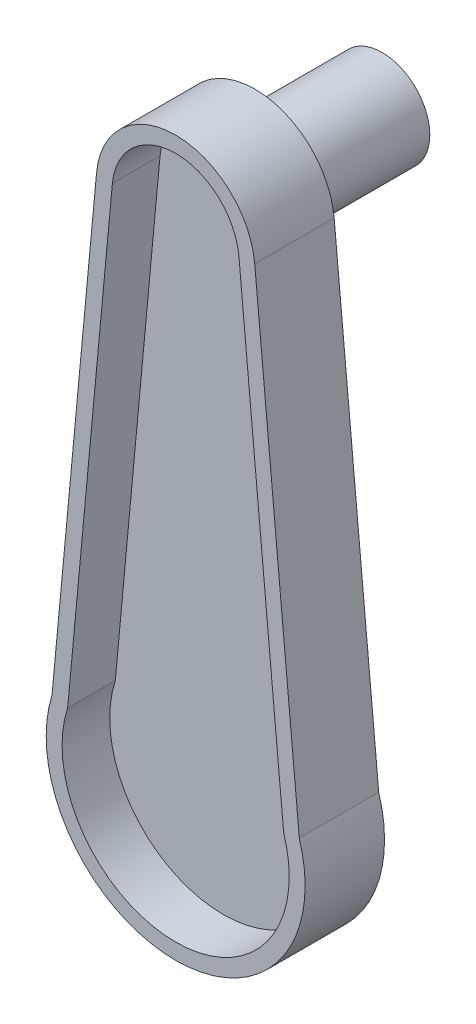
ISO-10303-21;
HEADER;
FILE_DESCRIPTION(('STEP AP214'),'2;1');
FILE_NAME('part.step','',(''),(''),'','','');
FILE_SCHEMA(('AUTOMOTIVE_DESIGN { 1 0 10303 214 1 1 1 1 }'));
ENDSEC;
DATA;
#1=APPLICATION_CONTEXT('core data for automotive mechanical design processes');
#2=APPLICATION_PROTOCOL_DEFINITION('international standard','automotive_design',2000,#1);
#3=PRODUCT_CONTEXT('',#1,'mechanical');
#4=PRODUCT('Part','Part','',(#3));
#5=PRODUCT_RELATED_PRODUCT_CATEGORY('part','',(#4));
#6=PRODUCT_DEFINITION_FORMATION('','',#4);
#7=PRODUCT_DEFINITION_CONTEXT('part definition',#1,'design');
#8=PRODUCT_DEFINITION('design','',#6,#7);
#9=PRODUCT_DEFINITION_SHAPE('','',#8);
#10=(LENGTH_UNIT() NAMED_UNIT(*) SI_UNIT(.MILLI.,.METRE.));
#11=(NAMED_UNIT(*) PLANE_ANGLE_UNIT() SI_UNIT($,.RADIAN.));
#12=(NAMED_UNIT(*) SI_UNIT($,.STERADIAN.) SOLID_ANGLE_UNIT());
#13=UNCERTAINTY_MEASURE_WITH_UNIT(LENGTH_MEASURE(1.E-05),#10,'distance_accuracy_value','');
#14=(GEOMETRIC_REPRESENTATION_CONTEXT(3) GLOBAL_UNCERTAINTY_ASSIGNED_CONTEXT((#13)) GLOBAL_UNIT_ASSIGNED_CONTEXT((#10,
#11,#12)) REPRESENTATION_CONTEXT('',''));
#15=CARTESIAN_POINT('',(0.,0.,0.));
#16=DIRECTION('',(0.,0.,1.));
#17=DIRECTION('',(1.,0.,0.));
#18=AXIS2_PLACEMENT_3D('',#15,#16,#17);
#19=CARTESIAN_POINT('',(0.,0.,1.));
#20=DIRECTION('',(0.,0.,1.));
#21=DIRECTION('',(1.,0.,0.));
#22=AXIS2_PLACEMENT_3D('',#19,#20,#21);
#23=PLANE('',#22);
#24=CARTESIAN_POINT('',(0.,0.,1.));
#25=DIRECTION('',(0.,0.,1.));
#26=DIRECTION('',(1.,0.,0.));
#27=AXIS2_PLACEMENT_3D('',#24,#25,#26);
#28=CIRCLE('',#27,3.575);
#29=CARTESIAN_POINT('',(-3.4,1.10481898969922,1.));
#30=VERTEX_POINT('',#29);
#31=CARTESIAN_POINT('',(3.4,1.10481898969922,1.));
#32=VERTEX_POINT('',#31);
#33=EDGE_CURVE('E211',#30,#32,#28,.T.);
#34=ORIENTED_EDGE('',*,*,#33,.T.);
#35=DIRECTION('',(-0.0934615986664953,0.995622885220455,0.));
#36=VECTOR('',#35,1.);
#37=CARTESIAN_POINT('',(3.4,1.10481898969922,1.));
#38=LINE('',#37,#36);
#39=CARTESIAN_POINT('',(1.99124577044091,16.111923197333,1.));
#40=VERTEX_POINT('',#39);
#41=EDGE_CURVE('E83',#32,#40,#38,.T.);
#42=ORIENTED_EDGE('',*,*,#41,.T.);
#43=CARTESIAN_POINT('',(0.,15.925,1.));
#44=DIRECTION('',(0.,0.,-1.));
#45=DIRECTION('',(-1.,0.,0.));
#46=AXIS2_PLACEMENT_3D('',#43,#44,#45);
#47=CIRCLE('',#46,2.);
#48=CARTESIAN_POINT('',(-1.99124577044091,16.111923197333,1.));
#49=VERTEX_POINT('',#48);
#50=EDGE_CURVE('E216',#49,#40,#47,.T.);
#51=ORIENTED_EDGE('',*,*,#50,.F.);
#52=DIRECTION('',(0.0934615986664953,0.995622885220455,0.));
#53=VECTOR('',#52,1.);
#54=CARTESIAN_POINT('',(-3.4,1.10481898969922,1.));
#55=LINE('',#54,#53);
#56=EDGE_CURVE('E72',#30,#49,#55,.T.);
#57=ORIENTED_EDGE('',*,*,#56,.F.);
#58=EDGE_LOOP('',(#34,#42,#51,#57));
#59=FACE_BOUND('',#58,.T.);
#60=ADVANCED_FACE('F63',(#59),#23,.T.);
#61=CARTESIAN_POINT('',(0.,0.,2.5));
#62=DIRECTION('',(0.,0.,1.));
#63=DIRECTION('',(1.,0.,0.));
#64=AXIS2_PLACEMENT_3D('',#61,#62,#63);
#65=PLANE('',#64);
#66=CARTESIAN_POINT('',(0.,0.,2.5));
#67=DIRECTION('',(0.,0.,1.));
#68=DIRECTION('',(1.,0.,0.));
#69=AXIS2_PLACEMENT_3D('',#66,#67,#68);
#70=CIRCLE('',#69,4.075);
#71=CARTESIAN_POINT('',(-3.89280761632953,1.20485429087933,2.5));
#72=VERTEX_POINT('',#71);
#73=CARTESIAN_POINT('',(3.89280761632953,1.20485429087933,2.5));
#74=VERTEX_POINT('',#73);
#75=EDGE_CURVE('E170',#72,#74,#70,.T.);
#76=ORIENTED_EDGE('',*,*,#75,.T.);
#77=DIRECTION('',(-0.0934615986664953,0.995622885220455,0.));
#78=VECTOR('',#77,1.);
#79=CARTESIAN_POINT('',(3.89781144261023,1.15154978903247,2.5));
#80=LINE('',#79,#78);
#81=CARTESIAN_POINT('',(2.48905721305114,16.1586539966662,2.5));
#82=VERTEX_POINT('',#81);
#83=EDGE_CURVE('E174',#74,#82,#80,.T.);
#84=ORIENTED_EDGE('',*,*,#83,.T.);
#85=CARTESIAN_POINT('',(0.,15.925,2.5));
#86=DIRECTION('',(0.,0.,1.));
#87=DIRECTION('',(1.,0.,0.));
#88=AXIS2_PLACEMENT_3D('',#85,#86,#87);
#89=CIRCLE('',#88,2.5);
#90=CARTESIAN_POINT('',(-2.48905721305114,16.1586539966662,2.5));
#91=VERTEX_POINT('',#90);
#92=EDGE_CURVE('E178',#82,#91,#89,.T.);
#93=ORIENTED_EDGE('',*,*,#92,.T.);
#94=DIRECTION('',(-0.0934615986664953,-0.995622885220455,0.));
#95=VECTOR('',#94,1.);
#96=CARTESIAN_POINT('',(-3.89781144261023,1.15154978903247,2.5));
#97=LINE('',#96,#95);
#98=EDGE_CURVE('E181',#91,#72,#97,.T.);
#99=ORIENTED_EDGE('',*,*,#98,.T.);
#100=EDGE_LOOP('',(#76,#84,#93,#99));
#101=FACE_BOUND('',#100,.T.);
#102=DIRECTION('',(-0.0934615986664953,0.995622885220455,0.));
#103=VECTOR('',#102,1.);
#104=CARTESIAN_POINT('',(3.4,1.10481898969922,2.5));
#105=LINE('',#104,#103);
#106=CARTESIAN_POINT('',(3.4,1.10481898969922,2.5));
#107=VERTEX_POINT('',#106);
#108=CARTESIAN_POINT('',(1.99124577044091,16.111923197333,2.5));
#109=VERTEX_POINT('',#108);
#110=EDGE_CURVE('E138',#107,#109,#105,.T.);
#111=ORIENTED_EDGE('',*,*,#110,.F.);
#112=CARTESIAN_POINT('',(0.,0.,2.5));
#113=DIRECTION('',(0.,0.,1.));
#114=DIRECTION('',(1.,0.,0.));
#115=AXIS2_PLACEMENT_3D('',#112,#113,#114);
#116=CIRCLE('',#115,3.575);
#117=CARTESIAN_POINT('',(-3.4,1.10481898969922,2.5));
#118=VERTEX_POINT('',#117);
#119=EDGE_CURVE('E128',#118,#107,#116,.T.);
#120=ORIENTED_EDGE('',*,*,#119,.F.);
#121=DIRECTION('',(-0.0934615986664953,-0.995622885220455,0.));
#122=VECTOR('',#121,1.);
#123=CARTESIAN_POINT('',(-3.4,1.10481898969922,2.5));
#124=LINE('',#123,#122);
#125=CARTESIAN_POINT('',(-1.99124577044091,16.111923197333,2.5));
#126=VERTEX_POINT('',#125);
#127=EDGE_CURVE('E156',#126,#118,#124,.T.);
#128=ORIENTED_EDGE('',*,*,#127,.F.);
#129=CARTESIAN_POINT('',(0.,15.925,2.5));
#130=DIRECTION('',(0.,0.,1.));
#131=DIRECTION('',(-1.,0.,0.));
#132=AXIS2_PLACEMENT_3D('',#129,#130,#131);
#133=CIRCLE('',#132,2.);
#134=EDGE_CURVE('E152',#109,#126,#133,.T.);
#135=ORIENTED_EDGE('',*,*,#134,.F.);
#136=EDGE_LOOP('',(#111,#120,#128,#135));
#137=FACE_BOUND('',#136,.T.);
#138=ADVANCED_FACE('F150',(#101,#137),#65,.T.);
#139=CARTESIAN_POINT('',(0.,0.,2.5));
#140=DIRECTION('',(0.,0.,-1.));
#141=DIRECTION('',(-1.,0.,0.));
#142=AXIS2_PLACEMENT_3D('',#139,#140,#141);
#143=CYLINDRICAL_SURFACE('',#142,4.075);
#144=CARTESIAN_POINT('',(0.,0.,0.));
#145=DIRECTION('',(0.,0.,1.));
#146=DIRECTION('',(1.,0.,0.));
#147=AXIS2_PLACEMENT_3D('',#144,#145,#146);
#148=CIRCLE('',#147,4.075);
#149=CARTESIAN_POINT('',(-3.89280761632953,1.20485429087933,0.));
#150=VERTEX_POINT('',#149);
#151=CARTESIAN_POINT('',(3.89280761632953,1.20485429087933,0.));
#152=VERTEX_POINT('',#151);
#153=EDGE_CURVE('E146',#150,#152,#148,.T.);
#154=ORIENTED_EDGE('',*,*,#153,.T.);
#155=DIRECTION('',(0.,0.,-1.));
#156=VECTOR('',#155,1.);
#157=CARTESIAN_POINT('',(3.89280761632953,1.20485429087933,2.5));
#158=LINE('',#157,#156);
#159=EDGE_CURVE('E207',#74,#152,#158,.T.);
#160=ORIENTED_EDGE('',*,*,#159,.F.);
#161=ORIENTED_EDGE('',*,*,#75,.F.);
#162=DIRECTION('',(0.,0.,-1.));
#163=VECTOR('',#162,1.);
#164=CARTESIAN_POINT('',(-3.89280761632953,1.20485429087933,2.5));
#165=LINE('',#164,#163);
#166=EDGE_CURVE('E184',#72,#150,#165,.T.);
#167=ORIENTED_EDGE('',*,*,#166,.T.);
#168=EDGE_LOOP('',(#154,#160,#161,#167));
#169=FACE_BOUND('',#168,.T.);
#170=ADVANCED_FACE('F227',(#169),#143,.T.);
#171=CARTESIAN_POINT('',(3.89781144261023,1.15154978903247,2.5));
#172=DIRECTION('',(-0.995622885220455,-0.0934615986664953,0.));
#173=DIRECTION('',(0.0934615986664953,-0.995622885220455,0.));
#174=AXIS2_PLACEMENT_3D('',#171,#172,#173);
#175=PLANE('',#174);
#176=DIRECTION('',(-0.0934615986664953,0.995622885220455,0.));
#177=VECTOR('',#176,1.);
#178=CARTESIAN_POINT('',(3.89781144261023,1.15154978903247,0.));
#179=LINE('',#178,#177);
#180=CARTESIAN_POINT('',(2.48905721305114,16.1586539966662,0.));
#181=VERTEX_POINT('',#180);
#182=EDGE_CURVE('E188',#152,#181,#179,.T.);
#183=ORIENTED_EDGE('',*,*,#182,.T.);
#184=DIRECTION('',(0.,0.,-1.));
#185=VECTOR('',#184,1.);
#186=CARTESIAN_POINT('',(2.48905721305114,16.1586539966662,2.5));
#187=LINE('',#186,#185);
#188=EDGE_CURVE('E203',#82,#181,#187,.T.);
#189=ORIENTED_EDGE('',*,*,#188,.F.);
#190=ORIENTED_EDGE('',*,*,#83,.F.);
#191=ORIENTED_EDGE('',*,*,#159,.T.);
#192=EDGE_LOOP('',(#183,#189,#190,#191));
#193=FACE_BOUND('',#192,.T.);
#194=ADVANCED_FACE('F233',(#193),#175,.F.);
#195=CARTESIAN_POINT('',(0.,15.925,2.5));
#196=DIRECTION('',(0.,0.,-1.));
#197=DIRECTION('',(-1.,0.,0.));
#198=AXIS2_PLACEMENT_3D('',#195,#196,#197);
#199=CYLINDRICAL_SURFACE('',#198,2.5);
#200=CARTESIAN_POINT('',(0.,15.925,0.));
#201=DIRECTION('',(0.,0.,1.));
#202=DIRECTION('',(1.,0.,0.));
#203=AXIS2_PLACEMENT_3D('',#200,#201,#202);
#204=CIRCLE('',#203,2.5);
#205=CARTESIAN_POINT('',(-2.48905721305114,16.1586539966662,0.));
#206=VERTEX_POINT('',#205);
#207=EDGE_CURVE('E191',#181,#206,#204,.T.);
#208=ORIENTED_EDGE('',*,*,#207,.T.);
#209=DIRECTION('',(0.,0.,-1.));
#210=VECTOR('',#209,1.);
#211=CARTESIAN_POINT('',(-2.48905721305114,16.1586539966662,2.5));
#212=LINE('',#211,#210);
#213=EDGE_CURVE('E199',#91,#206,#212,.T.);
#214=ORIENTED_EDGE('',*,*,#213,.F.);
#215=ORIENTED_EDGE('',*,*,#92,.F.);
#216=ORIENTED_EDGE('',*,*,#188,.T.);
#217=EDGE_LOOP('',(#208,#214,#215,#216));
#218=FACE_BOUND('',#217,.T.);
#219=ADVANCED_FACE('F237',(#218),#199,.T.);
#220=CARTESIAN_POINT('',(-3.89781144261023,1.15154978903247,2.5));
#221=DIRECTION('',(0.995622885220455,-0.0934615986664953,0.));
#222=DIRECTION('',(0.0934615986664953,0.995622885220455,0.));
#223=AXIS2_PLACEMENT_3D('',#220,#221,#222);
#224=PLANE('',#223);
#225=DIRECTION('',(-0.0934615986664953,-0.995622885220455,0.));
#226=VECTOR('',#225,1.);
#227=CARTESIAN_POINT('',(-3.89781144261023,1.15154978903247,0.));
#228=LINE('',#227,#226);
#229=EDGE_CURVE('E175',#206,#150,#228,.T.);
#230=ORIENTED_EDGE('',*,*,#229,.T.);
#231=ORIENTED_EDGE('',*,*,#166,.F.);
#232=ORIENTED_EDGE('',*,*,#98,.F.);
#233=ORIENTED_EDGE('',*,*,#213,.T.);
#234=EDGE_LOOP('',(#230,#231,#232,#233));
#235=FACE_BOUND('',#234,.T.);
#236=ADVANCED_FACE('F241',(#235),#224,.F.);
#237=CARTESIAN_POINT('',(0.,0.,2.5));
#238=DIRECTION('',(0.,0.,-1.));
#239=DIRECTION('',(-1.,0.,0.));
#240=AXIS2_PLACEMENT_3D('',#237,#238,#239);
#241=CYLINDRICAL_SURFACE('',#240,3.575);
#242=DIRECTION('',(0.,0.,-1.));
#243=VECTOR('',#242,1.);
#244=CARTESIAN_POINT('',(3.4,1.10481898969922,2.5));
#245=LINE('',#244,#243);
#246=EDGE_CURVE('E131',#107,#32,#245,.T.);
#247=ORIENTED_EDGE('',*,*,#246,.T.);
#248=ORIENTED_EDGE('',*,*,#33,.F.);
#249=DIRECTION('',(0.,0.,-1.));
#250=VECTOR('',#249,1.);
#251=CARTESIAN_POINT('',(-3.4,1.10481898969922,2.5));
#252=LINE('',#251,#250);
#253=EDGE_CURVE('E133',#118,#30,#252,.T.);
#254=ORIENTED_EDGE('',*,*,#253,.F.);
#255=ORIENTED_EDGE('',*,*,#119,.T.);
#256=EDGE_LOOP('',(#247,#248,#254,#255));
#257=FACE_BOUND('',#256,.T.);
#258=ADVANCED_FACE('F130',(#257),#241,.F.);
#259=CARTESIAN_POINT('',(3.4,1.10481898969922,2.5));
#260=DIRECTION('',(-0.995622885220455,-0.0934615986664953,0.));
#261=DIRECTION('',(0.0934615986664953,-0.995622885220455,0.));
#262=AXIS2_PLACEMENT_3D('',#259,#260,#261);
#263=PLANE('',#262);
#264=DIRECTION('',(0.,0.,-1.));
#265=VECTOR('',#264,1.);
#266=CARTESIAN_POINT('',(1.99124577044091,16.111923197333,2.5));
#267=LINE('',#266,#265);
#268=EDGE_CURVE('E147',#109,#40,#267,.T.);
#269=ORIENTED_EDGE('',*,*,#268,.T.);
#270=ORIENTED_EDGE('',*,*,#41,.F.);
#271=ORIENTED_EDGE('',*,*,#246,.F.);
#272=ORIENTED_EDGE('',*,*,#110,.T.);
#273=EDGE_LOOP('',(#269,#270,#271,#272));
#274=FACE_BOUND('',#273,.T.);
#275=ADVANCED_FACE('F143',(#274),#263,.T.);
#276=CARTESIAN_POINT('',(0.,15.925,2.5));
#277=DIRECTION('',(0.,0.,-1.));
#278=DIRECTION('',(-1.,0.,0.));
#279=AXIS2_PLACEMENT_3D('',#276,#277,#278);
#280=CYLINDRICAL_SURFACE('',#279,2.);
#281=DIRECTION('',(0.,0.,-1.));
#282=VECTOR('',#281,1.);
#283=CARTESIAN_POINT('',(-1.99124577044091,16.111923197333,2.5));
#284=LINE('',#283,#282);
#285=EDGE_CURVE('E164',#126,#49,#284,.T.);
#286=ORIENTED_EDGE('',*,*,#285,.T.);
#287=ORIENTED_EDGE('',*,*,#50,.T.);
#288=ORIENTED_EDGE('',*,*,#268,.F.);
#289=ORIENTED_EDGE('',*,*,#134,.T.);
#290=EDGE_LOOP('',(#286,#287,#288,#289));
#291=FACE_BOUND('',#290,.T.);
#292=ADVANCED_FACE('F222',(#291),#280,.F.);
#293=CARTESIAN_POINT('',(-3.4,1.10481898969922,2.5));
#294=DIRECTION('',(0.995622885220455,-0.0934615986664953,0.));
#295=DIRECTION('',(0.0934615986664953,0.995622885220455,0.));
#296=AXIS2_PLACEMENT_3D('',#293,#294,#295);
#297=PLANE('',#296);
#298=ORIENTED_EDGE('',*,*,#253,.T.);
#299=ORIENTED_EDGE('',*,*,#56,.T.);
#300=ORIENTED_EDGE('',*,*,#285,.F.);
#301=ORIENTED_EDGE('',*,*,#127,.T.);
#302=EDGE_LOOP('',(#298,#299,#300,#301));
#303=FACE_BOUND('',#302,.T.);
#304=ADVANCED_FACE('F220',(#303),#297,.T.);
#305=CARTESIAN_POINT('',(0.,0.,0.));
#306=DIRECTION('',(0.,0.,1.));
#307=DIRECTION('',(1.,0.,0.));
#308=AXIS2_PLACEMENT_3D('',#305,#306,#307);
#309=PLANE('',#308);
#310=CARTESIAN_POINT('',(0.,15.925,0.));
#311=DIRECTION('',(0.,0.,1.));
#312=DIRECTION('',(1.,0.,0.));
#313=AXIS2_PLACEMENT_3D('',#310,#311,#312);
#314=CIRCLE('',#313,1.5);
#315=CARTESIAN_POINT('',(1.5,15.925,0.));
#316=VERTEX_POINT('',#315);
#317=EDGE_CURVE('E12',#316,#316,#314,.F.);
#318=ORIENTED_EDGE('',*,*,#317,.F.);
#319=EDGE_LOOP('',(#318));
#320=FACE_BOUND('',#319,.T.);
#321=ORIENTED_EDGE('',*,*,#153,.F.);
#322=ORIENTED_EDGE('',*,*,#229,.F.);
#323=ORIENTED_EDGE('',*,*,#207,.F.);
#324=ORIENTED_EDGE('',*,*,#182,.F.);
#325=EDGE_LOOP('',(#321,#322,#323,#324));
#326=FACE_BOUND('',#325,.T.);
#327=ADVANCED_FACE('F65',(#320,#326),#309,.F.);
#328=CARTESIAN_POINT('',(0.,15.925,-4.));
#329=DIRECTION('',(0.,0.,1.));
#330=DIRECTION('',(1.,0.,0.));
#331=AXIS2_PLACEMENT_3D('',#328,#329,#330);
#332=CYLINDRICAL_SURFACE('',#331,1.5);
#333=CARTESIAN_POINT('',(0.,15.925,-4.));
#334=DIRECTION('',(0.,0.,-1.));
#335=DIRECTION('',(-1.,0.,0.));
#336=AXIS2_PLACEMENT_3D('',#333,#334,#335);
#337=CIRCLE('',#336,1.5);
#338=CARTESIAN_POINT('',(-1.5,15.925,-4.));
#339=VERTEX_POINT('',#338);
#340=EDGE_CURVE('E139',#339,#339,#337,.T.);
#341=ORIENTED_EDGE('',*,*,#340,.F.);
#342=EDGE_LOOP('',(#341));
#343=FACE_BOUND('',#342,.T.);
#344=ORIENTED_EDGE('',*,*,#317,.T.);
#345=EDGE_LOOP('',(#344));
#346=FACE_BOUND('',#345,.T.);
#347=ADVANCED_FACE('F254',(#343,#346),#332,.T.);
#348=CARTESIAN_POINT('',(0.,15.925,-4.));
#349=DIRECTION('',(0.,0.,-1.));
#350=DIRECTION('',(-1.,0.,0.));
#351=AXIS2_PLACEMENT_3D('',#348,#349,#350);
#352=PLANE('',#351);
#353=ORIENTED_EDGE('',*,*,#340,.T.);
#354=EDGE_LOOP('',(#353));
#355=FACE_BOUND('',#354,.T.);
#356=ADVANCED_FACE('F257',(#355),#352,.T.);
#357=CLOSED_SHELL('',(#60,#138,#170,#194,#219,#236,#258,#275,#292,#304,#327,#347,#356));
#358=MANIFOLD_SOLID_BREP('B2',#357);
#359=ADVANCED_BREP_SHAPE_REPRESENTATION('',(#18,#358),#14);
#360=SHAPE_DEFINITION_REPRESENTATION(#9,#359);
ENDSEC;
END-ISO-10303-21;
